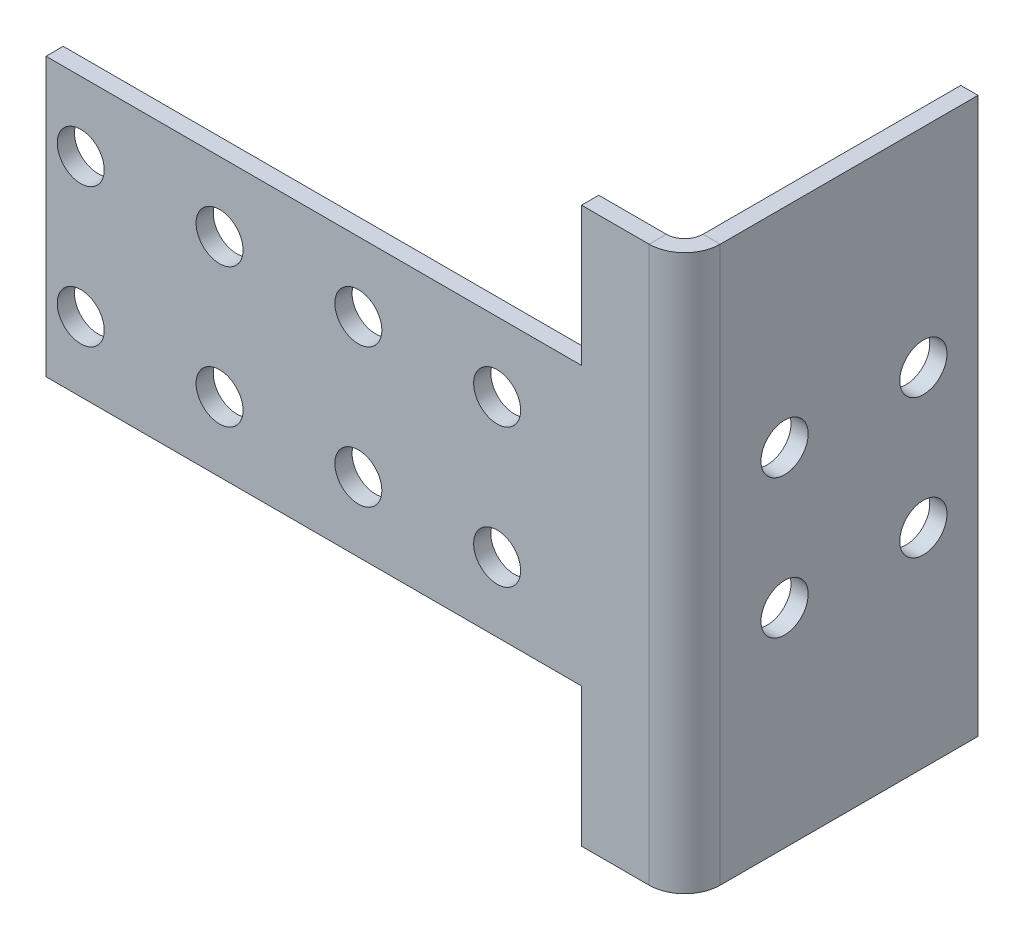
ISO-10303-21;
HEADER;
FILE_DESCRIPTION(('STEP AP214'),'2;1');
FILE_NAME('part.step','',(''),(''),'','','');
FILE_SCHEMA(('AUTOMOTIVE_DESIGN { 1 0 10303 214 1 1 1 1 }'));
ENDSEC;
DATA;
#1=APPLICATION_CONTEXT('core data for automotive mechanical design processes');
#2=APPLICATION_PROTOCOL_DEFINITION('international standard','automotive_design',2000,#1);
#3=PRODUCT_CONTEXT('',#1,'mechanical');
#4=PRODUCT('Part','Part','',(#3));
#5=PRODUCT_RELATED_PRODUCT_CATEGORY('part','',(#4));
#6=PRODUCT_DEFINITION_FORMATION('','',#4);
#7=PRODUCT_DEFINITION_CONTEXT('part definition',#1,'design');
#8=PRODUCT_DEFINITION('design','',#6,#7);
#9=PRODUCT_DEFINITION_SHAPE('','',#8);
#10=(LENGTH_UNIT() NAMED_UNIT(*) SI_UNIT(.MILLI.,.METRE.));
#11=(NAMED_UNIT(*) PLANE_ANGLE_UNIT() SI_UNIT($,.RADIAN.));
#12=(NAMED_UNIT(*) SI_UNIT($,.STERADIAN.) SOLID_ANGLE_UNIT());
#13=UNCERTAINTY_MEASURE_WITH_UNIT(LENGTH_MEASURE(1.E-05),#10,'distance_accuracy_value','');
#14=(GEOMETRIC_REPRESENTATION_CONTEXT(3) GLOBAL_UNCERTAINTY_ASSIGNED_CONTEXT((#13)) GLOBAL_UNIT_ASSIGNED_CONTEXT((#10,
#11,#12)) REPRESENTATION_CONTEXT('',''));
#15=CARTESIAN_POINT('',(0.,0.,0.));
#16=DIRECTION('',(0.,0.,1.));
#17=DIRECTION('',(1.,0.,0.));
#18=AXIS2_PLACEMENT_3D('',#15,#16,#17);
#19=CARTESIAN_POINT('',(58.4398205077934,0.,55.5601794922068));
#20=DIRECTION('',(-1.,0.,0.));
#21=DIRECTION('',(0.,0.,1.));
#22=AXIS2_PLACEMENT_3D('',#19,#20,#21);
#23=PLANE('',#22);
#24=CARTESIAN_POINT('',(58.4398205077932,19.05,-9.1398205077932));
#25=DIRECTION('',(1.,0.,0.));
#26=DIRECTION('',(0.,0.,-1.));
#27=AXIS2_PLACEMENT_3D('',#24,#25,#26);
#28=CIRCLE('',#27,2.16000000000001);
#29=CARTESIAN_POINT('',(58.4398205077932,19.05,-11.2998205077932));
#30=VERTEX_POINT('',#29);
#31=EDGE_CURVE('E268',#30,#30,#28,.T.);
#32=ORIENTED_EDGE('',*,*,#31,.F.);
#33=EDGE_LOOP('',(#32));
#34=FACE_BOUND('',#33,.T.);
#35=CARTESIAN_POINT('',(58.4398205077931,19.05,-21.8398205077932));
#36=DIRECTION('',(1.,0.,0.));
#37=DIRECTION('',(0.,0.,-1.));
#38=AXIS2_PLACEMENT_3D('',#35,#36,#37);
#39=CIRCLE('',#38,2.16);
#40=CARTESIAN_POINT('',(58.4398205077931,19.05,-23.9998205077932));
#41=VERTEX_POINT('',#40);
#42=EDGE_CURVE('E262',#41,#41,#39,.T.);
#43=ORIENTED_EDGE('',*,*,#42,.F.);
#44=EDGE_LOOP('',(#43));
#45=FACE_BOUND('',#44,.T.);
#46=CARTESIAN_POINT('',(58.4398205077932,6.34999999999999,-9.1398205077932));
#47=DIRECTION('',(1.,0.,0.));
#48=DIRECTION('',(0.,0.,-1.));
#49=AXIS2_PLACEMENT_3D('',#46,#47,#48);
#50=CIRCLE('',#49,2.16000000000001);
#51=CARTESIAN_POINT('',(58.4398205077932,6.34999999999999,-11.2998205077932));
#52=VERTEX_POINT('',#51);
#53=EDGE_CURVE('E254',#52,#52,#50,.T.);
#54=ORIENTED_EDGE('',*,*,#53,.F.);
#55=EDGE_LOOP('',(#54));
#56=FACE_BOUND('',#55,.T.);
#57=CARTESIAN_POINT('',(58.4398205077931,6.34999999999999,-21.8398205077932));
#58=DIRECTION('',(1.,0.,0.));
#59=DIRECTION('',(0.,0.,-1.));
#60=AXIS2_PLACEMENT_3D('',#57,#58,#59);
#61=CIRCLE('',#60,2.16);
#62=CARTESIAN_POINT('',(58.4398205077931,6.34999999999999,-23.9998205077932));
#63=VERTEX_POINT('',#62);
#64=EDGE_CURVE('E255',#63,#63,#61,.T.);
#65=ORIENTED_EDGE('',*,*,#64,.F.);
#66=EDGE_LOOP('',(#65));
#67=FACE_BOUND('',#66,.T.);
#68=DIRECTION('',(0.,0.,1.));
#69=VECTOR('',#68,1.);
#70=CARTESIAN_POINT('',(58.4398205077932,38.1,-1.4398205077932));
#71=LINE('',#70,#69);
#72=CARTESIAN_POINT('',(58.4398205077931,38.1,-26.8398205077932));
#73=VERTEX_POINT('',#72);
#74=CARTESIAN_POINT('',(58.4398205077932,38.1,-3.25120000000001));
#75=VERTEX_POINT('',#74);
#76=EDGE_CURVE('E64',#73,#75,#71,.T.);
#77=ORIENTED_EDGE('',*,*,#76,.T.);
#78=DIRECTION('',(0.,-1.,0.));
#79=VECTOR('',#78,1.);
#80=CARTESIAN_POINT('',(58.4398205077932,0.,-3.25120000000001));
#81=LINE('',#80,#79);
#82=CARTESIAN_POINT('',(58.4398205077932,-12.7,-3.25120000000001));
#83=VERTEX_POINT('',#82);
#84=EDGE_CURVE('E56',#75,#83,#81,.T.);
#85=ORIENTED_EDGE('',*,*,#84,.T.);
#86=DIRECTION('',(0.,0.,-1.));
#87=VECTOR('',#86,1.);
#88=CARTESIAN_POINT('',(58.4398205077932,-12.7,-1.4398205077932));
#89=LINE('',#88,#87);
#90=CARTESIAN_POINT('',(58.4398205077931,-12.7,-26.8398205077932));
#91=VERTEX_POINT('',#90);
#92=EDGE_CURVE('E72',#83,#91,#89,.T.);
#93=ORIENTED_EDGE('',*,*,#92,.T.);
#94=DIRECTION('',(0.,1.,0.));
#95=VECTOR('',#94,1.);
#96=CARTESIAN_POINT('',(58.4398205077931,38.1,-26.8398205077932));
#97=LINE('',#96,#95);
#98=EDGE_CURVE('E280',#91,#73,#97,.T.);
#99=ORIENTED_EDGE('',*,*,#98,.T.);
#100=EDGE_LOOP('',(#77,#85,#93,#99));
#101=FACE_BOUND('',#100,.T.);
#102=ADVANCED_FACE('F47',(#34,#45,#56,#67,#101),#23,.F.);
#103=CARTESIAN_POINT('',(56.8650205077932,38.1,-1.4398205077932));
#104=DIRECTION('',(0.,1.,0.));
#105=DIRECTION('',(1.,0.,0.));
#106=AXIS2_PLACEMENT_3D('',#103,#104,#105);
#107=PLANE('',#106);
#108=DIRECTION('',(-1.,0.,0.));
#109=VECTOR('',#108,1.);
#110=CARTESIAN_POINT('',(56.8650205077932,38.1,-3.2512));
#111=LINE('',#110,#109);
#112=CARTESIAN_POINT('',(56.8650205077932,38.1,-3.2512));
#113=VERTEX_POINT('',#112);
#114=EDGE_CURVE('E12',#75,#113,#111,.T.);
#115=ORIENTED_EDGE('',*,*,#114,.F.);
#116=ORIENTED_EDGE('',*,*,#76,.F.);
#117=DIRECTION('',(1.,0.,0.));
#118=VECTOR('',#117,1.);
#119=CARTESIAN_POINT('',(56.8650205077931,38.1,-26.8398205077932));
#120=LINE('',#119,#118);
#121=CARTESIAN_POINT('',(56.8650205077931,38.1,-26.8398205077932));
#122=VERTEX_POINT('',#121);
#123=EDGE_CURVE('E282',#122,#73,#120,.T.);
#124=ORIENTED_EDGE('',*,*,#123,.F.);
#125=DIRECTION('',(0.,0.,1.));
#126=VECTOR('',#125,1.);
#127=CARTESIAN_POINT('',(56.8650205077932,38.1,6.5601794922068));
#128=LINE('',#127,#126);
#129=EDGE_CURVE('E289',#122,#113,#128,.T.);
#130=ORIENTED_EDGE('',*,*,#129,.T.);
#131=EDGE_LOOP('',(#115,#116,#124,#130));
#132=FACE_BOUND('',#131,.T.);
#133=ADVANCED_FACE('F49',(#132),#107,.T.);
#134=CARTESIAN_POINT('',(56.8650205077931,38.1,-26.8398205077932));
#135=DIRECTION('',(0.,0.,-1.));
#136=DIRECTION('',(-1.,0.,0.));
#137=AXIS2_PLACEMENT_3D('',#134,#135,#136);
#138=PLANE('',#137);
#139=ORIENTED_EDGE('',*,*,#98,.F.);
#140=DIRECTION('',(1.,0.,0.));
#141=VECTOR('',#140,1.);
#142=CARTESIAN_POINT('',(56.8650205077931,-12.7,-26.8398205077932));
#143=LINE('',#142,#141);
#144=CARTESIAN_POINT('',(56.8650205077931,-12.7,-26.8398205077932));
#145=VERTEX_POINT('',#144);
#146=EDGE_CURVE('E279',#145,#91,#143,.T.);
#147=ORIENTED_EDGE('',*,*,#146,.F.);
#148=DIRECTION('',(0.,1.,0.));
#149=VECTOR('',#148,1.);
#150=CARTESIAN_POINT('',(56.8650205077931,38.1,-26.8398205077932));
#151=LINE('',#150,#149);
#152=EDGE_CURVE('E276',#145,#122,#151,.T.);
#153=ORIENTED_EDGE('',*,*,#152,.T.);
#154=ORIENTED_EDGE('',*,*,#123,.T.);
#155=EDGE_LOOP('',(#139,#147,#153,#154));
#156=FACE_BOUND('',#155,.T.);
#157=ADVANCED_FACE('F299',(#156),#138,.T.);
#158=CARTESIAN_POINT('',(56.8650205077932,-12.7,-1.4398205077932));
#159=DIRECTION('',(0.,-1.,0.));
#160=DIRECTION('',(0.,0.,-1.));
#161=AXIS2_PLACEMENT_3D('',#158,#159,#160);
#162=PLANE('',#161);
#163=DIRECTION('',(1.,0.,0.));
#164=VECTOR('',#163,1.);
#165=CARTESIAN_POINT('',(56.8650205077932,-12.7,-3.2512));
#166=LINE('',#165,#164);
#167=CARTESIAN_POINT('',(56.8650205077932,-12.7,-3.2512));
#168=VERTEX_POINT('',#167);
#169=EDGE_CURVE('E286',#168,#83,#166,.T.);
#170=ORIENTED_EDGE('',*,*,#169,.F.);
#171=DIRECTION('',(0.,0.,-1.));
#172=VECTOR('',#171,1.);
#173=CARTESIAN_POINT('',(56.8650205077932,-12.7,6.5601794922068));
#174=LINE('',#173,#172);
#175=EDGE_CURVE('E51',#168,#145,#174,.T.);
#176=ORIENTED_EDGE('',*,*,#175,.T.);
#177=ORIENTED_EDGE('',*,*,#146,.T.);
#178=ORIENTED_EDGE('',*,*,#92,.F.);
#179=EDGE_LOOP('',(#170,#176,#177,#178));
#180=FACE_BOUND('',#179,.T.);
#181=ADVANCED_FACE('F295',(#180),#162,.T.);
#182=CARTESIAN_POINT('',(56.8650205077934,0.,55.5601794922068));
#183=DIRECTION('',(-1.,0.,0.));
#184=DIRECTION('',(0.,0.,1.));
#185=AXIS2_PLACEMENT_3D('',#182,#183,#184);
#186=PLANE('',#185);
#187=DIRECTION('',(0.,-1.,0.));
#188=VECTOR('',#187,1.);
#189=CARTESIAN_POINT('',(56.8650205077932,0.,-3.2512));
#190=LINE('',#189,#188);
#191=EDGE_CURVE('E159',#113,#168,#190,.T.);
#192=ORIENTED_EDGE('',*,*,#191,.F.);
#193=ORIENTED_EDGE('',*,*,#129,.F.);
#194=ORIENTED_EDGE('',*,*,#152,.F.);
#195=ORIENTED_EDGE('',*,*,#175,.F.);
#196=EDGE_LOOP('',(#192,#193,#194,#195));
#197=FACE_BOUND('',#196,.T.);
#198=CARTESIAN_POINT('',(56.8650205077931,6.34999999999999,-21.8398205077932));
#199=DIRECTION('',(1.,0.,0.));
#200=DIRECTION('',(0.,0.,-1.));
#201=AXIS2_PLACEMENT_3D('',#198,#199,#200);
#202=CIRCLE('',#201,2.16);
#203=CARTESIAN_POINT('',(56.8650205077931,6.34999999999999,-23.9998205077932));
#204=VERTEX_POINT('',#203);
#205=EDGE_CURVE('E251',#204,#204,#202,.T.);
#206=ORIENTED_EDGE('',*,*,#205,.T.);
#207=EDGE_LOOP('',(#206));
#208=FACE_BOUND('',#207,.T.);
#209=CARTESIAN_POINT('',(56.8650205077932,6.34999999999999,-9.1398205077932));
#210=DIRECTION('',(1.,0.,0.));
#211=DIRECTION('',(0.,0.,-1.));
#212=AXIS2_PLACEMENT_3D('',#209,#210,#211);
#213=CIRCLE('',#212,2.16000000000001);
#214=CARTESIAN_POINT('',(56.8650205077932,6.34999999999999,-11.2998205077932));
#215=VERTEX_POINT('',#214);
#216=EDGE_CURVE('E259',#215,#215,#213,.T.);
#217=ORIENTED_EDGE('',*,*,#216,.T.);
#218=EDGE_LOOP('',(#217));
#219=FACE_BOUND('',#218,.T.);
#220=CARTESIAN_POINT('',(56.8650205077931,19.05,-21.8398205077932));
#221=DIRECTION('',(1.,0.,0.));
#222=DIRECTION('',(0.,0.,-1.));
#223=AXIS2_PLACEMENT_3D('',#220,#221,#222);
#224=CIRCLE('',#223,2.16);
#225=CARTESIAN_POINT('',(56.8650205077931,19.05,-23.9998205077932));
#226=VERTEX_POINT('',#225);
#227=EDGE_CURVE('E265',#226,#226,#224,.T.);
#228=ORIENTED_EDGE('',*,*,#227,.T.);
#229=EDGE_LOOP('',(#228));
#230=FACE_BOUND('',#229,.T.);
#231=CARTESIAN_POINT('',(56.8650205077932,19.05,-9.1398205077932));
#232=DIRECTION('',(1.,0.,0.));
#233=DIRECTION('',(0.,0.,-1.));
#234=AXIS2_PLACEMENT_3D('',#231,#232,#233);
#235=CIRCLE('',#234,2.16000000000001);
#236=CARTESIAN_POINT('',(56.8650205077932,19.05,-11.2998205077932));
#237=VERTEX_POINT('',#236);
#238=EDGE_CURVE('E271',#237,#237,#235,.T.);
#239=ORIENTED_EDGE('',*,*,#238,.T.);
#240=EDGE_LOOP('',(#239));
#241=FACE_BOUND('',#240,.T.);
#242=ADVANCED_FACE('F382',(#197,#208,#219,#230,#241),#186,.T.);
#243=CARTESIAN_POINT('',(56.8650205077932,19.05,-9.1398205077932));
#244=DIRECTION('',(1.,0.,0.));
#245=DIRECTION('',(0.,0.,-1.));
#246=AXIS2_PLACEMENT_3D('',#243,#244,#245);
#247=CYLINDRICAL_SURFACE('',#246,2.16000000000001);
#248=ORIENTED_EDGE('',*,*,#238,.F.);
#249=EDGE_LOOP('',(#248));
#250=FACE_BOUND('',#249,.T.);
#251=ORIENTED_EDGE('',*,*,#31,.T.);
#252=EDGE_LOOP('',(#251));
#253=FACE_BOUND('',#252,.T.);
#254=ADVANCED_FACE('F385',(#250,#253),#247,.F.);
#255=CARTESIAN_POINT('',(56.8650205077931,19.05,-21.8398205077932));
#256=DIRECTION('',(1.,0.,0.));
#257=DIRECTION('',(0.,0.,-1.));
#258=AXIS2_PLACEMENT_3D('',#255,#256,#257);
#259=CYLINDRICAL_SURFACE('',#258,2.16);
#260=ORIENTED_EDGE('',*,*,#227,.F.);
#261=EDGE_LOOP('',(#260));
#262=FACE_BOUND('',#261,.T.);
#263=ORIENTED_EDGE('',*,*,#42,.T.);
#264=EDGE_LOOP('',(#263));
#265=FACE_BOUND('',#264,.T.);
#266=ADVANCED_FACE('F391',(#262,#265),#259,.F.);
#267=CARTESIAN_POINT('',(56.8650205077932,6.34999999999999,-9.1398205077932));
#268=DIRECTION('',(1.,0.,0.));
#269=DIRECTION('',(0.,0.,-1.));
#270=AXIS2_PLACEMENT_3D('',#267,#268,#269);
#271=CYLINDRICAL_SURFACE('',#270,2.16000000000001);
#272=ORIENTED_EDGE('',*,*,#216,.F.);
#273=EDGE_LOOP('',(#272));
#274=FACE_BOUND('',#273,.T.);
#275=ORIENTED_EDGE('',*,*,#53,.T.);
#276=EDGE_LOOP('',(#275));
#277=FACE_BOUND('',#276,.T.);
#278=ADVANCED_FACE('F395',(#274,#277),#271,.F.);
#279=CARTESIAN_POINT('',(56.8650205077931,6.34999999999999,-21.8398205077932));
#280=DIRECTION('',(1.,0.,0.));
#281=DIRECTION('',(0.,0.,-1.));
#282=AXIS2_PLACEMENT_3D('',#279,#280,#281);
#283=CYLINDRICAL_SURFACE('',#282,2.16);
#284=ORIENTED_EDGE('',*,*,#205,.F.);
#285=EDGE_LOOP('',(#284));
#286=FACE_BOUND('',#285,.T.);
#287=ORIENTED_EDGE('',*,*,#64,.T.);
#288=EDGE_LOOP('',(#287));
#289=FACE_BOUND('',#288,.T.);
#290=ADVANCED_FACE('F399',(#286,#289),#283,.F.);
#291=CARTESIAN_POINT('',(49.,25.4,-1.5748));
#292=DIRECTION('',(-1.,0.,0.));
#293=DIRECTION('',(0.,0.,1.));
#294=AXIS2_PLACEMENT_3D('',#291,#292,#293);
#295=PLANE('',#294);
#296=DIRECTION('',(0.,-1.,0.));
#297=VECTOR('',#296,1.);
#298=CARTESIAN_POINT('',(49.,25.4,0.));
#299=LINE('',#298,#297);
#300=CARTESIAN_POINT('',(49.,38.1,0.));
#301=VERTEX_POINT('',#300);
#302=CARTESIAN_POINT('',(49.,25.4,0.));
#303=VERTEX_POINT('',#302);
#304=EDGE_CURVE('E334',#301,#303,#299,.T.);
#305=ORIENTED_EDGE('',*,*,#304,.F.);
#306=DIRECTION('',(0.,0.,1.));
#307=VECTOR('',#306,1.);
#308=CARTESIAN_POINT('',(49.,38.1,-1.5748));
#309=LINE('',#308,#307);
#310=CARTESIAN_POINT('',(49.,38.1,-1.5748));
#311=VERTEX_POINT('',#310);
#312=EDGE_CURVE('E258',#311,#301,#309,.T.);
#313=ORIENTED_EDGE('',*,*,#312,.F.);
#314=DIRECTION('',(0.,-1.,0.));
#315=VECTOR('',#314,1.);
#316=CARTESIAN_POINT('',(49.,25.4,-1.5748));
#317=LINE('',#316,#315);
#318=CARTESIAN_POINT('',(49.,25.4,-1.5748));
#319=VERTEX_POINT('',#318);
#320=EDGE_CURVE('E247',#311,#319,#317,.T.);
#321=ORIENTED_EDGE('',*,*,#320,.T.);
#322=DIRECTION('',(0.,0.,1.));
#323=VECTOR('',#322,1.);
#324=CARTESIAN_POINT('',(49.,25.4,-1.5748));
#325=LINE('',#324,#323);
#326=EDGE_CURVE('E245',#319,#303,#325,.T.);
#327=ORIENTED_EDGE('',*,*,#326,.T.);
#328=EDGE_LOOP('',(#305,#313,#321,#327));
#329=FACE_BOUND('',#328,.T.);
#330=ADVANCED_FACE('F345',(#329),#295,.T.);
#331=CARTESIAN_POINT('',(0.,25.4,-1.5748));
#332=DIRECTION('',(0.,1.,0.));
#333=DIRECTION('',(-1.,0.,0.));
#334=AXIS2_PLACEMENT_3D('',#331,#332,#333);
#335=PLANE('',#334);
#336=DIRECTION('',(-1.,0.,0.));
#337=VECTOR('',#336,1.);
#338=CARTESIAN_POINT('',(0.,25.4,0.));
#339=LINE('',#338,#337);
#340=CARTESIAN_POINT('',(0.,25.4,0.));
#341=VERTEX_POINT('',#340);
#342=EDGE_CURVE('E331',#303,#341,#339,.T.);
#343=ORIENTED_EDGE('',*,*,#342,.F.);
#344=ORIENTED_EDGE('',*,*,#326,.F.);
#345=DIRECTION('',(-1.,0.,0.));
#346=VECTOR('',#345,1.);
#347=CARTESIAN_POINT('',(0.,25.4,-1.5748));
#348=LINE('',#347,#346);
#349=CARTESIAN_POINT('',(0.,25.4,-1.5748));
#350=VERTEX_POINT('',#349);
#351=EDGE_CURVE('E242',#319,#350,#348,.T.);
#352=ORIENTED_EDGE('',*,*,#351,.T.);
#353=DIRECTION('',(0.,0.,1.));
#354=VECTOR('',#353,1.);
#355=CARTESIAN_POINT('',(0.,25.4,-1.5748));
#356=LINE('',#355,#354);
#357=EDGE_CURVE('E240',#350,#341,#356,.T.);
#358=ORIENTED_EDGE('',*,*,#357,.T.);
#359=EDGE_LOOP('',(#343,#344,#352,#358));
#360=FACE_BOUND('',#359,.T.);
#361=ADVANCED_FACE('F349',(#360),#335,.T.);
#362=CARTESIAN_POINT('',(0.,25.4,-1.5748));
#363=DIRECTION('',(-1.,0.,0.));
#364=DIRECTION('',(0.,0.,1.));
#365=AXIS2_PLACEMENT_3D('',#362,#363,#364);
#366=PLANE('',#365);
#367=DIRECTION('',(0.,-1.,0.));
#368=VECTOR('',#367,1.);
#369=CARTESIAN_POINT('',(0.,25.4,0.));
#370=LINE('',#369,#368);
#371=CARTESIAN_POINT('',(0.,0.,0.));
#372=VERTEX_POINT('',#371);
#373=EDGE_CURVE('E328',#341,#372,#370,.T.);
#374=ORIENTED_EDGE('',*,*,#373,.F.);
#375=ORIENTED_EDGE('',*,*,#357,.F.);
#376=DIRECTION('',(0.,-1.,0.));
#377=VECTOR('',#376,1.);
#378=CARTESIAN_POINT('',(0.,25.4,-1.5748));
#379=LINE('',#378,#377);
#380=CARTESIAN_POINT('',(0.,0.,-1.5748));
#381=VERTEX_POINT('',#380);
#382=EDGE_CURVE('E237',#350,#381,#379,.T.);
#383=ORIENTED_EDGE('',*,*,#382,.T.);
#384=DIRECTION('',(0.,0.,1.));
#385=VECTOR('',#384,1.);
#386=CARTESIAN_POINT('',(0.,0.,-1.5748));
#387=LINE('',#386,#385);
#388=EDGE_CURVE('E235',#381,#372,#387,.T.);
#389=ORIENTED_EDGE('',*,*,#388,.T.);
#390=EDGE_LOOP('',(#374,#375,#383,#389));
#391=FACE_BOUND('',#390,.T.);
#392=ADVANCED_FACE('F353',(#391),#366,.T.);
#393=CARTESIAN_POINT('',(0.,0.,-1.5748));
#394=DIRECTION('',(0.,-1.,0.));
#395=DIRECTION('',(0.,0.,-1.));
#396=AXIS2_PLACEMENT_3D('',#393,#394,#395);
#397=PLANE('',#396);
#398=DIRECTION('',(1.,0.,0.));
#399=VECTOR('',#398,1.);
#400=CARTESIAN_POINT('',(0.,0.,0.));
#401=LINE('',#400,#399);
#402=CARTESIAN_POINT('',(49.,0.,0.));
#403=VERTEX_POINT('',#402);
#404=EDGE_CURVE('E325',#372,#403,#401,.T.);
#405=ORIENTED_EDGE('',*,*,#404,.F.);
#406=ORIENTED_EDGE('',*,*,#388,.F.);
#407=DIRECTION('',(1.,0.,0.));
#408=VECTOR('',#407,1.);
#409=CARTESIAN_POINT('',(0.,0.,-1.5748));
#410=LINE('',#409,#408);
#411=CARTESIAN_POINT('',(49.,0.,-1.5748));
#412=VERTEX_POINT('',#411);
#413=EDGE_CURVE('E232',#381,#412,#410,.T.);
#414=ORIENTED_EDGE('',*,*,#413,.T.);
#415=DIRECTION('',(0.,0.,1.));
#416=VECTOR('',#415,1.);
#417=CARTESIAN_POINT('',(49.,0.,-1.5748));
#418=LINE('',#417,#416);
#419=EDGE_CURVE('E230',#412,#403,#418,.T.);
#420=ORIENTED_EDGE('',*,*,#419,.T.);
#421=EDGE_LOOP('',(#405,#406,#414,#420));
#422=FACE_BOUND('',#421,.T.);
#423=ADVANCED_FACE('F357',(#422),#397,.T.);
#424=CARTESIAN_POINT('',(49.,-12.7,-1.5748));
#425=DIRECTION('',(-1.,0.,0.));
#426=DIRECTION('',(0.,0.,1.));
#427=AXIS2_PLACEMENT_3D('',#424,#425,#426);
#428=PLANE('',#427);
#429=DIRECTION('',(0.,-1.,0.));
#430=VECTOR('',#429,1.);
#431=CARTESIAN_POINT('',(49.,-12.7,0.));
#432=LINE('',#431,#430);
#433=CARTESIAN_POINT('',(49.,-12.7,0.));
#434=VERTEX_POINT('',#433);
#435=EDGE_CURVE('E322',#403,#434,#432,.T.);
#436=ORIENTED_EDGE('',*,*,#435,.F.);
#437=ORIENTED_EDGE('',*,*,#419,.F.);
#438=DIRECTION('',(0.,-1.,0.));
#439=VECTOR('',#438,1.);
#440=CARTESIAN_POINT('',(49.,-12.7,-1.5748));
#441=LINE('',#440,#439);
#442=CARTESIAN_POINT('',(49.,-12.7,-1.5748));
#443=VERTEX_POINT('',#442);
#444=EDGE_CURVE('E228',#412,#443,#441,.T.);
#445=ORIENTED_EDGE('',*,*,#444,.T.);
#446=DIRECTION('',(0.,0.,1.));
#447=VECTOR('',#446,1.);
#448=CARTESIAN_POINT('',(49.,-12.7,-1.5748));
#449=LINE('',#448,#447);
#450=EDGE_CURVE('E176',#443,#434,#449,.T.);
#451=ORIENTED_EDGE('',*,*,#450,.T.);
#452=EDGE_LOOP('',(#436,#437,#445,#451));
#453=FACE_BOUND('',#452,.T.);
#454=ADVANCED_FACE('F360',(#453),#428,.T.);
#455=CARTESIAN_POINT('',(41.28,6.35,-1.5748));
#456=DIRECTION('',(0.,0.,1.));
#457=DIRECTION('',(1.,0.,0.));
#458=AXIS2_PLACEMENT_3D('',#455,#456,#457);
#459=CYLINDRICAL_SURFACE('',#458,2.15);
#460=CARTESIAN_POINT('',(41.28,6.35,-1.5748));
#461=DIRECTION('',(0.,0.,1.));
#462=DIRECTION('',(1.,0.,0.));
#463=AXIS2_PLACEMENT_3D('',#460,#461,#462);
#464=CIRCLE('',#463,2.15);
#465=CARTESIAN_POINT('',(43.43,6.35,-1.5748));
#466=VERTEX_POINT('',#465);
#467=EDGE_CURVE('E172',#466,#466,#464,.T.);
#468=ORIENTED_EDGE('',*,*,#467,.F.);
#469=EDGE_LOOP('',(#468));
#470=FACE_BOUND('',#469,.T.);
#471=CARTESIAN_POINT('',(41.28,6.35,0.));
#472=DIRECTION('',(0.,0.,1.));
#473=DIRECTION('',(1.,0.,0.));
#474=AXIS2_PLACEMENT_3D('',#471,#472,#473);
#475=CIRCLE('',#474,2.15);
#476=CARTESIAN_POINT('',(43.43,6.35,0.));
#477=VERTEX_POINT('',#476);
#478=EDGE_CURVE('E224',#477,#477,#475,.T.);
#479=ORIENTED_EDGE('',*,*,#478,.T.);
#480=EDGE_LOOP('',(#479));
#481=FACE_BOUND('',#480,.T.);
#482=ADVANCED_FACE('F362',(#470,#481),#459,.F.);
#483=CARTESIAN_POINT('',(3.18,6.35,-1.5748));
#484=DIRECTION('',(0.,0.,1.));
#485=DIRECTION('',(1.,0.,0.));
#486=AXIS2_PLACEMENT_3D('',#483,#484,#485);
#487=CYLINDRICAL_SURFACE('',#486,2.15);
#488=CARTESIAN_POINT('',(3.18,6.35,-1.5748));
#489=DIRECTION('',(0.,0.,1.));
#490=DIRECTION('',(1.,0.,0.));
#491=AXIS2_PLACEMENT_3D('',#488,#489,#490);
#492=CIRCLE('',#491,2.15);
#493=CARTESIAN_POINT('',(5.33,6.35,-1.5748));
#494=VERTEX_POINT('',#493);
#495=EDGE_CURVE('E182',#494,#494,#492,.T.);
#496=ORIENTED_EDGE('',*,*,#495,.F.);
#497=EDGE_LOOP('',(#496));
#498=FACE_BOUND('',#497,.T.);
#499=CARTESIAN_POINT('',(3.18,6.35,0.));
#500=DIRECTION('',(0.,0.,1.));
#501=DIRECTION('',(1.,0.,0.));
#502=AXIS2_PLACEMENT_3D('',#499,#500,#501);
#503=CIRCLE('',#502,2.15);
#504=CARTESIAN_POINT('',(5.33,6.35,0.));
#505=VERTEX_POINT('',#504);
#506=EDGE_CURVE('E221',#505,#505,#503,.T.);
#507=ORIENTED_EDGE('',*,*,#506,.T.);
#508=EDGE_LOOP('',(#507));
#509=FACE_BOUND('',#508,.T.);
#510=ADVANCED_FACE('F368',(#498,#509),#487,.F.);
#511=CARTESIAN_POINT('',(28.58,6.35,-1.5748));
#512=DIRECTION('',(0.,0.,1.));
#513=DIRECTION('',(1.,0.,0.));
#514=AXIS2_PLACEMENT_3D('',#511,#512,#513);
#515=CYLINDRICAL_SURFACE('',#514,2.15);
#516=CARTESIAN_POINT('',(28.58,6.35,-1.5748));
#517=DIRECTION('',(0.,0.,1.));
#518=DIRECTION('',(1.,0.,0.));
#519=AXIS2_PLACEMENT_3D('',#516,#517,#518);
#520=CIRCLE('',#519,2.15);
#521=CARTESIAN_POINT('',(30.73,6.35,-1.5748));
#522=VERTEX_POINT('',#521);
#523=EDGE_CURVE('E185',#522,#522,#520,.T.);
#524=ORIENTED_EDGE('',*,*,#523,.F.);
#525=EDGE_LOOP('',(#524));
#526=FACE_BOUND('',#525,.T.);
#527=CARTESIAN_POINT('',(28.58,6.35,0.));
#528=DIRECTION('',(0.,0.,1.));
#529=DIRECTION('',(1.,0.,0.));
#530=AXIS2_PLACEMENT_3D('',#527,#528,#529);
#531=CIRCLE('',#530,2.15);
#532=CARTESIAN_POINT('',(30.73,6.35,0.));
#533=VERTEX_POINT('',#532);
#534=EDGE_CURVE('E218',#533,#533,#531,.T.);
#535=ORIENTED_EDGE('',*,*,#534,.T.);
#536=EDGE_LOOP('',(#535));
#537=FACE_BOUND('',#536,.T.);
#538=ADVANCED_FACE('F432',(#526,#537),#515,.F.);
#539=CARTESIAN_POINT('',(15.88,6.35,-1.5748));
#540=DIRECTION('',(0.,0.,1.));
#541=DIRECTION('',(1.,0.,0.));
#542=AXIS2_PLACEMENT_3D('',#539,#540,#541);
#543=CYLINDRICAL_SURFACE('',#542,2.15);
#544=CARTESIAN_POINT('',(15.88,6.35,-1.5748));
#545=DIRECTION('',(0.,0.,1.));
#546=DIRECTION('',(1.,0.,0.));
#547=AXIS2_PLACEMENT_3D('',#544,#545,#546);
#548=CIRCLE('',#547,2.15);
#549=CARTESIAN_POINT('',(18.03,6.35,-1.5748));
#550=VERTEX_POINT('',#549);
#551=EDGE_CURVE('E188',#550,#550,#548,.T.);
#552=ORIENTED_EDGE('',*,*,#551,.F.);
#553=EDGE_LOOP('',(#552));
#554=FACE_BOUND('',#553,.T.);
#555=CARTESIAN_POINT('',(15.88,6.35,0.));
#556=DIRECTION('',(0.,0.,1.));
#557=DIRECTION('',(1.,0.,0.));
#558=AXIS2_PLACEMENT_3D('',#555,#556,#557);
#559=CIRCLE('',#558,2.15);
#560=CARTESIAN_POINT('',(18.03,6.35,0.));
#561=VERTEX_POINT('',#560);
#562=EDGE_CURVE('E215',#561,#561,#559,.T.);
#563=ORIENTED_EDGE('',*,*,#562,.T.);
#564=EDGE_LOOP('',(#563));
#565=FACE_BOUND('',#564,.T.);
#566=ADVANCED_FACE('F428',(#554,#565),#543,.F.);
#567=CARTESIAN_POINT('',(28.58,19.05,-1.5748));
#568=DIRECTION('',(0.,0.,1.));
#569=DIRECTION('',(1.,0.,0.));
#570=AXIS2_PLACEMENT_3D('',#567,#568,#569);
#571=CYLINDRICAL_SURFACE('',#570,2.15);
#572=CARTESIAN_POINT('',(28.58,19.05,-1.5748));
#573=DIRECTION('',(0.,0.,1.));
#574=DIRECTION('',(1.,0.,0.));
#575=AXIS2_PLACEMENT_3D('',#572,#573,#574);
#576=CIRCLE('',#575,2.15);
#577=CARTESIAN_POINT('',(30.73,19.05,-1.5748));
#578=VERTEX_POINT('',#577);
#579=EDGE_CURVE('E191',#578,#578,#576,.T.);
#580=ORIENTED_EDGE('',*,*,#579,.F.);
#581=EDGE_LOOP('',(#580));
#582=FACE_BOUND('',#581,.T.);
#583=CARTESIAN_POINT('',(28.58,19.05,0.));
#584=DIRECTION('',(0.,0.,1.));
#585=DIRECTION('',(1.,0.,0.));
#586=AXIS2_PLACEMENT_3D('',#583,#584,#585);
#587=CIRCLE('',#586,2.15);
#588=CARTESIAN_POINT('',(30.73,19.05,0.));
#589=VERTEX_POINT('',#588);
#590=EDGE_CURVE('E212',#589,#589,#587,.T.);
#591=ORIENTED_EDGE('',*,*,#590,.T.);
#592=EDGE_LOOP('',(#591));
#593=FACE_BOUND('',#592,.T.);
#594=ADVANCED_FACE('F424',(#582,#593),#571,.F.);
#595=CARTESIAN_POINT('',(15.88,19.05,-1.5748));
#596=DIRECTION('',(0.,0.,1.));
#597=DIRECTION('',(1.,0.,0.));
#598=AXIS2_PLACEMENT_3D('',#595,#596,#597);
#599=CYLINDRICAL_SURFACE('',#598,2.15);
#600=CARTESIAN_POINT('',(15.88,19.05,-1.5748));
#601=DIRECTION('',(0.,0.,1.));
#602=DIRECTION('',(1.,0.,0.));
#603=AXIS2_PLACEMENT_3D('',#600,#601,#602);
#604=CIRCLE('',#603,2.15);
#605=CARTESIAN_POINT('',(18.03,19.05,-1.5748));
#606=VERTEX_POINT('',#605);
#607=EDGE_CURVE('E194',#606,#606,#604,.T.);
#608=ORIENTED_EDGE('',*,*,#607,.F.);
#609=EDGE_LOOP('',(#608));
#610=FACE_BOUND('',#609,.T.);
#611=CARTESIAN_POINT('',(15.88,19.05,0.));
#612=DIRECTION('',(0.,0.,1.));
#613=DIRECTION('',(1.,0.,0.));
#614=AXIS2_PLACEMENT_3D('',#611,#612,#613);
#615=CIRCLE('',#614,2.15);
#616=CARTESIAN_POINT('',(18.03,19.05,0.));
#617=VERTEX_POINT('',#616);
#618=EDGE_CURVE('E209',#617,#617,#615,.T.);
#619=ORIENTED_EDGE('',*,*,#618,.T.);
#620=EDGE_LOOP('',(#619));
#621=FACE_BOUND('',#620,.T.);
#622=ADVANCED_FACE('F420',(#610,#621),#599,.F.);
#623=CARTESIAN_POINT('',(3.18,19.05,-1.5748));
#624=DIRECTION('',(0.,0.,1.));
#625=DIRECTION('',(1.,0.,0.));
#626=AXIS2_PLACEMENT_3D('',#623,#624,#625);
#627=CYLINDRICAL_SURFACE('',#626,2.15);
#628=CARTESIAN_POINT('',(3.18,19.05,-1.5748));
#629=DIRECTION('',(0.,0.,1.));
#630=DIRECTION('',(1.,0.,0.));
#631=AXIS2_PLACEMENT_3D('',#628,#629,#630);
#632=CIRCLE('',#631,2.15);
#633=CARTESIAN_POINT('',(5.33,19.05,-1.5748));
#634=VERTEX_POINT('',#633);
#635=EDGE_CURVE('E197',#634,#634,#632,.T.);
#636=ORIENTED_EDGE('',*,*,#635,.F.);
#637=EDGE_LOOP('',(#636));
#638=FACE_BOUND('',#637,.T.);
#639=CARTESIAN_POINT('',(3.18,19.05,0.));
#640=DIRECTION('',(0.,0.,1.));
#641=DIRECTION('',(1.,0.,0.));
#642=AXIS2_PLACEMENT_3D('',#639,#640,#641);
#643=CIRCLE('',#642,2.15);
#644=CARTESIAN_POINT('',(5.33,19.05,0.));
#645=VERTEX_POINT('',#644);
#646=EDGE_CURVE('E206',#645,#645,#643,.T.);
#647=ORIENTED_EDGE('',*,*,#646,.T.);
#648=EDGE_LOOP('',(#647));
#649=FACE_BOUND('',#648,.T.);
#650=ADVANCED_FACE('F416',(#638,#649),#627,.F.);
#651=CARTESIAN_POINT('',(41.28,19.05,-1.5748));
#652=DIRECTION('',(0.,0.,1.));
#653=DIRECTION('',(1.,0.,0.));
#654=AXIS2_PLACEMENT_3D('',#651,#652,#653);
#655=CYLINDRICAL_SURFACE('',#654,2.15);
#656=CARTESIAN_POINT('',(41.28,19.05,-1.5748));
#657=DIRECTION('',(0.,0.,1.));
#658=DIRECTION('',(1.,0.,0.));
#659=AXIS2_PLACEMENT_3D('',#656,#657,#658);
#660=CIRCLE('',#659,2.15);
#661=CARTESIAN_POINT('',(43.43,19.05,-1.5748));
#662=VERTEX_POINT('',#661);
#663=EDGE_CURVE('E200',#662,#662,#660,.T.);
#664=ORIENTED_EDGE('',*,*,#663,.F.);
#665=EDGE_LOOP('',(#664));
#666=FACE_BOUND('',#665,.T.);
#667=CARTESIAN_POINT('',(41.28,19.05,0.));
#668=DIRECTION('',(0.,0.,1.));
#669=DIRECTION('',(1.,0.,0.));
#670=AXIS2_PLACEMENT_3D('',#667,#668,#669);
#671=CIRCLE('',#670,2.15);
#672=CARTESIAN_POINT('',(43.43,19.05,0.));
#673=VERTEX_POINT('',#672);
#674=EDGE_CURVE('E203',#673,#673,#671,.T.);
#675=ORIENTED_EDGE('',*,*,#674,.T.);
#676=EDGE_LOOP('',(#675));
#677=FACE_BOUND('',#676,.T.);
#678=ADVANCED_FACE('F412',(#666,#677),#655,.F.);
#679=CARTESIAN_POINT('',(0.,0.,-1.5748));
#680=DIRECTION('',(0.,0.,-1.));
#681=DIRECTION('',(-1.,0.,0.));
#682=AXIS2_PLACEMENT_3D('',#679,#680,#681);
#683=PLANE('',#682);
#684=ORIENTED_EDGE('',*,*,#663,.T.);
#685=EDGE_LOOP('',(#684));
#686=FACE_BOUND('',#685,.T.);
#687=ORIENTED_EDGE('',*,*,#635,.T.);
#688=EDGE_LOOP('',(#687));
#689=FACE_BOUND('',#688,.T.);
#690=ORIENTED_EDGE('',*,*,#607,.T.);
#691=EDGE_LOOP('',(#690));
#692=FACE_BOUND('',#691,.T.);
#693=ORIENTED_EDGE('',*,*,#579,.T.);
#694=EDGE_LOOP('',(#693));
#695=FACE_BOUND('',#694,.T.);
#696=ORIENTED_EDGE('',*,*,#551,.T.);
#697=EDGE_LOOP('',(#696));
#698=FACE_BOUND('',#697,.T.);
#699=ORIENTED_EDGE('',*,*,#523,.T.);
#700=EDGE_LOOP('',(#699));
#701=FACE_BOUND('',#700,.T.);
#702=ORIENTED_EDGE('',*,*,#495,.T.);
#703=EDGE_LOOP('',(#702));
#704=FACE_BOUND('',#703,.T.);
#705=ORIENTED_EDGE('',*,*,#467,.T.);
#706=EDGE_LOOP('',(#705));
#707=FACE_BOUND('',#706,.T.);
#708=DIRECTION('',(-1.,0.,0.));
#709=VECTOR('',#708,1.);
#710=CARTESIAN_POINT('',(49.,38.1,-1.5748));
#711=LINE('',#710,#709);
#712=CARTESIAN_POINT('',(55.1886205077932,38.1,-1.5748));
#713=VERTEX_POINT('',#712);
#714=EDGE_CURVE('E170',#713,#311,#711,.T.);
#715=ORIENTED_EDGE('',*,*,#714,.F.);
#716=DIRECTION('',(0.,-1.,0.));
#717=VECTOR('',#716,1.);
#718=CARTESIAN_POINT('',(55.1886205077932,0.,-1.5748));
#719=LINE('',#718,#717);
#720=CARTESIAN_POINT('',(55.1886205077932,-12.7,-1.5748));
#721=VERTEX_POINT('',#720);
#722=EDGE_CURVE('E157',#713,#721,#719,.T.);
#723=ORIENTED_EDGE('',*,*,#722,.T.);
#724=DIRECTION('',(1.,0.,0.));
#725=VECTOR('',#724,1.);
#726=CARTESIAN_POINT('',(49.,-12.7,-1.5748));
#727=LINE('',#726,#725);
#728=EDGE_CURVE('E150',#443,#721,#727,.T.);
#729=ORIENTED_EDGE('',*,*,#728,.F.);
#730=ORIENTED_EDGE('',*,*,#444,.F.);
#731=ORIENTED_EDGE('',*,*,#413,.F.);
#732=ORIENTED_EDGE('',*,*,#382,.F.);
#733=ORIENTED_EDGE('',*,*,#351,.F.);
#734=ORIENTED_EDGE('',*,*,#320,.F.);
#735=EDGE_LOOP('',(#715,#723,#729,#730,#731,#732,#733,#734));
#736=FACE_BOUND('',#735,.T.);
#737=ADVANCED_FACE('F166',(#686,#689,#692,#695,#698,#701,#704,#707,#736),#683,.T.);
#738=CARTESIAN_POINT('',(57.,-12.7,-1.5748));
#739=DIRECTION('',(0.,-1.,0.));
#740=DIRECTION('',(1.,0.,0.));
#741=AXIS2_PLACEMENT_3D('',#738,#739,#740);
#742=PLANE('',#741);
#743=ORIENTED_EDGE('',*,*,#728,.T.);
#744=DIRECTION('',(0.,0.,1.));
#745=VECTOR('',#744,1.);
#746=CARTESIAN_POINT('',(55.1886205077932,-12.7,-1.5748));
#747=LINE('',#746,#745);
#748=CARTESIAN_POINT('',(55.1886205077932,-12.7,0.));
#749=VERTEX_POINT('',#748);
#750=EDGE_CURVE('E139',#721,#749,#747,.T.);
#751=ORIENTED_EDGE('',*,*,#750,.T.);
#752=DIRECTION('',(1.,0.,0.));
#753=VECTOR('',#752,1.);
#754=CARTESIAN_POINT('',(57.,-12.7,0.));
#755=LINE('',#754,#753);
#756=EDGE_CURVE('E319',#434,#749,#755,.T.);
#757=ORIENTED_EDGE('',*,*,#756,.F.);
#758=ORIENTED_EDGE('',*,*,#450,.F.);
#759=EDGE_LOOP('',(#743,#751,#757,#758));
#760=FACE_BOUND('',#759,.T.);
#761=ADVANCED_FACE('F174',(#760),#742,.T.);
#762=CARTESIAN_POINT('',(0.,0.,0.));
#763=DIRECTION('',(0.,0.,-1.));
#764=DIRECTION('',(-1.,0.,0.));
#765=AXIS2_PLACEMENT_3D('',#762,#763,#764);
#766=PLANE('',#765);
#767=DIRECTION('',(0.,-1.,0.));
#768=VECTOR('',#767,1.);
#769=CARTESIAN_POINT('',(55.1886205077932,0.,0.));
#770=LINE('',#769,#768);
#771=CARTESIAN_POINT('',(55.1886205077932,38.1,0.));
#772=VERTEX_POINT('',#771);
#773=EDGE_CURVE('E160',#772,#749,#770,.T.);
#774=ORIENTED_EDGE('',*,*,#773,.F.);
#775=DIRECTION('',(-1.,0.,0.));
#776=VECTOR('',#775,1.);
#777=CARTESIAN_POINT('',(57.,38.1,0.));
#778=LINE('',#777,#776);
#779=EDGE_CURVE('E149',#772,#301,#778,.T.);
#780=ORIENTED_EDGE('',*,*,#779,.T.);
#781=ORIENTED_EDGE('',*,*,#304,.T.);
#782=ORIENTED_EDGE('',*,*,#342,.T.);
#783=ORIENTED_EDGE('',*,*,#373,.T.);
#784=ORIENTED_EDGE('',*,*,#404,.T.);
#785=ORIENTED_EDGE('',*,*,#435,.T.);
#786=ORIENTED_EDGE('',*,*,#756,.T.);
#787=EDGE_LOOP('',(#774,#780,#781,#782,#783,#784,#785,#786));
#788=FACE_BOUND('',#787,.T.);
#789=ORIENTED_EDGE('',*,*,#478,.F.);
#790=EDGE_LOOP('',(#789));
#791=FACE_BOUND('',#790,.T.);
#792=ORIENTED_EDGE('',*,*,#506,.F.);
#793=EDGE_LOOP('',(#792));
#794=FACE_BOUND('',#793,.T.);
#795=ORIENTED_EDGE('',*,*,#534,.F.);
#796=EDGE_LOOP('',(#795));
#797=FACE_BOUND('',#796,.T.);
#798=ORIENTED_EDGE('',*,*,#562,.F.);
#799=EDGE_LOOP('',(#798));
#800=FACE_BOUND('',#799,.T.);
#801=ORIENTED_EDGE('',*,*,#590,.F.);
#802=EDGE_LOOP('',(#801));
#803=FACE_BOUND('',#802,.T.);
#804=ORIENTED_EDGE('',*,*,#618,.F.);
#805=EDGE_LOOP('',(#804));
#806=FACE_BOUND('',#805,.T.);
#807=ORIENTED_EDGE('',*,*,#646,.F.);
#808=EDGE_LOOP('',(#807));
#809=FACE_BOUND('',#808,.T.);
#810=ORIENTED_EDGE('',*,*,#674,.F.);
#811=EDGE_LOOP('',(#810));
#812=FACE_BOUND('',#811,.T.);
#813=ADVANCED_FACE('F338',(#788,#791,#794,#797,#800,#803,#806,#809,#812),#766,.F.);
#814=CARTESIAN_POINT('',(57.,38.1,-1.5748));
#815=DIRECTION('',(0.,1.,0.));
#816=DIRECTION('',(0.,0.,1.));
#817=AXIS2_PLACEMENT_3D('',#814,#815,#816);
#818=PLANE('',#817);
#819=ORIENTED_EDGE('',*,*,#779,.F.);
#820=DIRECTION('',(0.,0.,-1.));
#821=VECTOR('',#820,1.);
#822=CARTESIAN_POINT('',(55.1886205077932,38.1,-1.5748));
#823=LINE('',#822,#821);
#824=EDGE_CURVE('E310',#772,#713,#823,.T.);
#825=ORIENTED_EDGE('',*,*,#824,.T.);
#826=ORIENTED_EDGE('',*,*,#714,.T.);
#827=ORIENTED_EDGE('',*,*,#312,.T.);
#828=EDGE_LOOP('',(#819,#825,#826,#827));
#829=FACE_BOUND('',#828,.T.);
#830=ADVANCED_FACE('F343',(#829),#818,.T.);
#831=CARTESIAN_POINT('',(55.1886205077932,38.1,-3.2512));
#832=DIRECTION('',(0.,-1.,0.));
#833=DIRECTION('',(0.,0.,-1.));
#834=AXIS2_PLACEMENT_3D('',#831,#832,#833);
#835=PLANE('',#834);
#836=ORIENTED_EDGE('',*,*,#824,.F.);
#837=CARTESIAN_POINT('',(55.1886205077932,38.1,-3.2512));
#838=DIRECTION('',(0.,-1.,0.));
#839=DIRECTION('',(0.,0.,-1.));
#840=AXIS2_PLACEMENT_3D('',#837,#838,#839);
#841=CIRCLE('',#840,3.2512);
#842=EDGE_CURVE('E307',#772,#75,#841,.F.);
#843=ORIENTED_EDGE('',*,*,#842,.T.);
#844=ORIENTED_EDGE('',*,*,#114,.T.);
#845=CARTESIAN_POINT('',(55.1886205077932,38.1,-3.2512));
#846=DIRECTION('',(0.,1.,0.));
#847=DIRECTION('',(0.,0.,-1.));
#848=AXIS2_PLACEMENT_3D('',#845,#846,#847);
#849=CIRCLE('',#848,1.6764);
#850=EDGE_CURVE('E161',#713,#113,#849,.T.);
#851=ORIENTED_EDGE('',*,*,#850,.F.);
#852=EDGE_LOOP('',(#836,#843,#844,#851));
#853=FACE_BOUND('',#852,.T.);
#854=ADVANCED_FACE('F309',(#853),#835,.F.);
#855=CARTESIAN_POINT('',(55.1886205077932,-12.7,-3.2512));
#856=DIRECTION('',(0.,1.,0.));
#857=DIRECTION('',(0.,0.,1.));
#858=AXIS2_PLACEMENT_3D('',#855,#856,#857);
#859=PLANE('',#858);
#860=CARTESIAN_POINT('',(55.1886205077932,-12.7,-3.2512));
#861=DIRECTION('',(0.,-1.,0.));
#862=DIRECTION('',(0.,0.,-1.));
#863=AXIS2_PLACEMENT_3D('',#860,#861,#862);
#864=CIRCLE('',#863,3.2512);
#865=EDGE_CURVE('E145',#83,#749,#864,.T.);
#866=ORIENTED_EDGE('',*,*,#865,.T.);
#867=ORIENTED_EDGE('',*,*,#750,.F.);
#868=CARTESIAN_POINT('',(55.1886205077932,-12.7,-3.2512));
#869=DIRECTION('',(0.,-1.,0.));
#870=DIRECTION('',(0.,0.,1.));
#871=AXIS2_PLACEMENT_3D('',#868,#869,#870);
#872=CIRCLE('',#871,1.6764);
#873=EDGE_CURVE('E143',#168,#721,#872,.T.);
#874=ORIENTED_EDGE('',*,*,#873,.F.);
#875=ORIENTED_EDGE('',*,*,#169,.T.);
#876=EDGE_LOOP('',(#866,#867,#874,#875));
#877=FACE_BOUND('',#876,.T.);
#878=ADVANCED_FACE('F141',(#877),#859,.F.);
#879=CARTESIAN_POINT('',(55.1886205077932,63.6533549209387,-3.2512));
#880=DIRECTION('',(0.,-1.,0.));
#881=DIRECTION('',(0.,0.,-1.));
#882=AXIS2_PLACEMENT_3D('',#879,#880,#881);
#883=CYLINDRICAL_SURFACE('',#882,1.6764);
#884=ORIENTED_EDGE('',*,*,#191,.T.);
#885=ORIENTED_EDGE('',*,*,#873,.T.);
#886=ORIENTED_EDGE('',*,*,#722,.F.);
#887=ORIENTED_EDGE('',*,*,#850,.T.);
#888=EDGE_LOOP('',(#884,#885,#886,#887));
#889=FACE_BOUND('',#888,.T.);
#890=ADVANCED_FACE('F155',(#889),#883,.F.);
#891=CARTESIAN_POINT('',(55.1886205077932,63.6533549209387,-3.2512));
#892=DIRECTION('',(0.,-1.,0.));
#893=DIRECTION('',(0.,0.,-1.));
#894=AXIS2_PLACEMENT_3D('',#891,#892,#893);
#895=CYLINDRICAL_SURFACE('',#894,3.2512);
#896=ORIENTED_EDGE('',*,*,#84,.F.);
#897=ORIENTED_EDGE('',*,*,#842,.F.);
#898=ORIENTED_EDGE('',*,*,#773,.T.);
#899=ORIENTED_EDGE('',*,*,#865,.F.);
#900=EDGE_LOOP('',(#896,#897,#898,#899));
#901=FACE_BOUND('',#900,.T.);
#902=ADVANCED_FACE('F306',(#901),#895,.T.);
#903=CLOSED_SHELL('',(#102,#133,#157,#181,#242,#254,#266,#278,#290,#330,#361,#392,#423,#454,
#482,#510,#538,#566,#594,#622,#650,#678,#737,#761,#813,#830,#854,#878,#890,#902));
#904=MANIFOLD_SOLID_BREP('B2',#903);
#905=ADVANCED_BREP_SHAPE_REPRESENTATION('',(#18,#904),#14);
#906=SHAPE_DEFINITION_REPRESENTATION(#9,#905);
ENDSEC;
END-ISO-10303-21;
